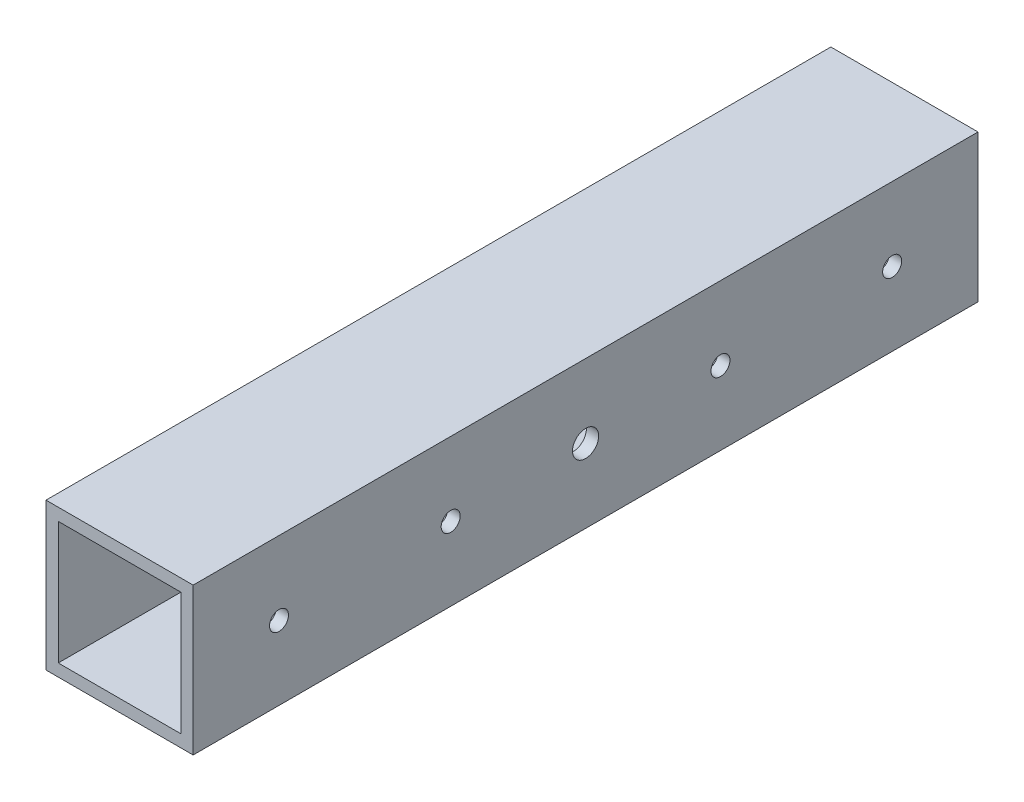
ISO-10303-21;
HEADER;
FILE_DESCRIPTION(('STEP AP214'),'2;1');
FILE_NAME('part.step','',(''),(''),'','','');
FILE_SCHEMA(('AUTOMOTIVE_DESIGN { 1 0 10303 214 1 1 1 1 }'));
ENDSEC;
DATA;
#1=APPLICATION_CONTEXT('core data for automotive mechanical design processes');
#2=APPLICATION_PROTOCOL_DEFINITION('international standard','automotive_design',2000,#1);
#3=PRODUCT_CONTEXT('',#1,'mechanical');
#4=PRODUCT('Part','Part','',(#3));
#5=PRODUCT_RELATED_PRODUCT_CATEGORY('part','',(#4));
#6=PRODUCT_DEFINITION_FORMATION('','',#4);
#7=PRODUCT_DEFINITION_CONTEXT('part definition',#1,'design');
#8=PRODUCT_DEFINITION('design','',#6,#7);
#9=PRODUCT_DEFINITION_SHAPE('','',#8);
#10=(LENGTH_UNIT() NAMED_UNIT(*) SI_UNIT(.MILLI.,.METRE.));
#11=(NAMED_UNIT(*) PLANE_ANGLE_UNIT() SI_UNIT($,.RADIAN.));
#12=(NAMED_UNIT(*) SI_UNIT($,.STERADIAN.) SOLID_ANGLE_UNIT());
#13=UNCERTAINTY_MEASURE_WITH_UNIT(LENGTH_MEASURE(1.E-05),#10,'distance_accuracy_value','');
#14=(GEOMETRIC_REPRESENTATION_CONTEXT(3) GLOBAL_UNCERTAINTY_ASSIGNED_CONTEXT((#13)) GLOBAL_UNIT_ASSIGNED_CONTEXT((#10,
#11,#12)) REPRESENTATION_CONTEXT('',''));
#15=CARTESIAN_POINT('',(0.,0.,0.));
#16=DIRECTION('',(0.,0.,1.));
#17=DIRECTION('',(1.,0.,0.));
#18=AXIS2_PLACEMENT_3D('',#15,#16,#17);
#19=CARTESIAN_POINT('',(1.04083408558608E-13,0.,203.2));
#20=DIRECTION('',(0.,0.,-1.));
#21=DIRECTION('',(-1.,0.,0.));
#22=AXIS2_PLACEMENT_3D('',#19,#20,#21);
#23=PLANE('',#22);
#24=DIRECTION('',(0.,1.,0.));
#25=VECTOR('',#24,1.);
#26=CARTESIAN_POINT('',(19.0500000000001,-19.05,203.2));
#27=LINE('',#26,#25);
#28=CARTESIAN_POINT('',(19.0500000000001,-19.05,203.2));
#29=VERTEX_POINT('',#28);
#30=CARTESIAN_POINT('',(19.0500000000001,19.05,203.2));
#31=VERTEX_POINT('',#30);
#32=EDGE_CURVE('E155',#29,#31,#27,.T.);
#33=ORIENTED_EDGE('',*,*,#32,.T.);
#34=DIRECTION('',(-1.,0.,0.));
#35=VECTOR('',#34,1.);
#36=CARTESIAN_POINT('',(-19.05,19.05,203.2));
#37=LINE('',#36,#35);
#38=CARTESIAN_POINT('',(-19.05,19.05,203.2));
#39=VERTEX_POINT('',#38);
#40=EDGE_CURVE('E159',#31,#39,#37,.T.);
#41=ORIENTED_EDGE('',*,*,#40,.T.);
#42=DIRECTION('',(0.,-1.,0.));
#43=VECTOR('',#42,1.);
#44=CARTESIAN_POINT('',(-19.05,-19.05,203.2));
#45=LINE('',#44,#43);
#46=CARTESIAN_POINT('',(-19.05,-19.05,203.2));
#47=VERTEX_POINT('',#46);
#48=EDGE_CURVE('E163',#39,#47,#45,.T.);
#49=ORIENTED_EDGE('',*,*,#48,.T.);
#50=DIRECTION('',(1.,0.,0.));
#51=VECTOR('',#50,1.);
#52=CARTESIAN_POINT('',(-19.05,-19.05,203.2));
#53=LINE('',#52,#51);
#54=EDGE_CURVE('E166',#47,#29,#53,.T.);
#55=ORIENTED_EDGE('',*,*,#54,.T.);
#56=EDGE_LOOP('',(#33,#41,#49,#55));
#57=FACE_BOUND('',#56,.T.);
#58=DIRECTION('',(0.,-1.,0.));
#59=VECTOR('',#58,1.);
#60=CARTESIAN_POINT('',(-15.875,-15.875,203.2));
#61=LINE('',#60,#59);
#62=CARTESIAN_POINT('',(-15.875,15.875,203.2));
#63=VERTEX_POINT('',#62);
#64=CARTESIAN_POINT('',(-15.875,-15.875,203.2));
#65=VERTEX_POINT('',#64);
#66=EDGE_CURVE('E104',#63,#65,#61,.T.);
#67=ORIENTED_EDGE('',*,*,#66,.F.);
#68=DIRECTION('',(-1.,0.,0.));
#69=VECTOR('',#68,1.);
#70=CARTESIAN_POINT('',(-15.875,15.875,203.2));
#71=LINE('',#70,#69);
#72=CARTESIAN_POINT('',(15.8750000000001,15.875,203.2));
#73=VERTEX_POINT('',#72);
#74=EDGE_CURVE('E131',#73,#63,#71,.T.);
#75=ORIENTED_EDGE('',*,*,#74,.F.);
#76=DIRECTION('',(0.,1.,0.));
#77=VECTOR('',#76,1.);
#78=CARTESIAN_POINT('',(15.8750000000001,-15.875,203.2));
#79=LINE('',#78,#77);
#80=CARTESIAN_POINT('',(15.8750000000001,-15.875,203.2));
#81=VERTEX_POINT('',#80);
#82=EDGE_CURVE('E126',#81,#73,#79,.T.);
#83=ORIENTED_EDGE('',*,*,#82,.F.);
#84=DIRECTION('',(1.,0.,0.));
#85=VECTOR('',#84,1.);
#86=CARTESIAN_POINT('',(-15.875,-15.875,203.2));
#87=LINE('',#86,#85);
#88=EDGE_CURVE('E113',#65,#81,#87,.T.);
#89=ORIENTED_EDGE('',*,*,#88,.F.);
#90=EDGE_LOOP('',(#67,#75,#83,#89));
#91=FACE_BOUND('',#90,.T.);
#92=ADVANCED_FACE('F36',(#57,#91),#23,.F.);
#93=CARTESIAN_POINT('',(0.,0.,0.));
#94=DIRECTION('',(0.,0.,-1.));
#95=DIRECTION('',(-1.,0.,0.));
#96=AXIS2_PLACEMENT_3D('',#93,#94,#95);
#97=PLANE('',#96);
#98=DIRECTION('',(0.,1.,0.));
#99=VECTOR('',#98,1.);
#100=CARTESIAN_POINT('',(19.05,-19.05,0.));
#101=LINE('',#100,#99);
#102=CARTESIAN_POINT('',(19.05,-19.05,0.));
#103=VERTEX_POINT('',#102);
#104=CARTESIAN_POINT('',(19.05,19.05,0.));
#105=VERTEX_POINT('',#104);
#106=EDGE_CURVE('E122',#103,#105,#101,.T.);
#107=ORIENTED_EDGE('',*,*,#106,.F.);
#108=DIRECTION('',(1.,0.,0.));
#109=VECTOR('',#108,1.);
#110=CARTESIAN_POINT('',(-19.05,-19.05,0.));
#111=LINE('',#110,#109);
#112=CARTESIAN_POINT('',(-19.05,-19.05,0.));
#113=VERTEX_POINT('',#112);
#114=EDGE_CURVE('E160',#113,#103,#111,.T.);
#115=ORIENTED_EDGE('',*,*,#114,.F.);
#116=DIRECTION('',(0.,-1.,0.));
#117=VECTOR('',#116,1.);
#118=CARTESIAN_POINT('',(-19.05,-19.05,0.));
#119=LINE('',#118,#117);
#120=CARTESIAN_POINT('',(-19.05,19.05,0.));
#121=VERTEX_POINT('',#120);
#122=EDGE_CURVE('E176',#121,#113,#119,.T.);
#123=ORIENTED_EDGE('',*,*,#122,.F.);
#124=DIRECTION('',(-1.,0.,0.));
#125=VECTOR('',#124,1.);
#126=CARTESIAN_POINT('',(-19.05,19.05,0.));
#127=LINE('',#126,#125);
#128=EDGE_CURVE('E173',#105,#121,#127,.T.);
#129=ORIENTED_EDGE('',*,*,#128,.F.);
#130=EDGE_LOOP('',(#107,#115,#123,#129));
#131=FACE_BOUND('',#130,.T.);
#132=DIRECTION('',(-1.,0.,0.));
#133=VECTOR('',#132,1.);
#134=CARTESIAN_POINT('',(-15.875,15.875,0.));
#135=LINE('',#134,#133);
#136=CARTESIAN_POINT('',(15.875,15.875,0.));
#137=VERTEX_POINT('',#136);
#138=CARTESIAN_POINT('',(-15.875,15.875,0.));
#139=VERTEX_POINT('',#138);
#140=EDGE_CURVE('E114',#137,#139,#135,.T.);
#141=ORIENTED_EDGE('',*,*,#140,.T.);
#142=DIRECTION('',(0.,-1.,0.));
#143=VECTOR('',#142,1.);
#144=CARTESIAN_POINT('',(-15.875,-15.875,0.));
#145=LINE('',#144,#143);
#146=CARTESIAN_POINT('',(-15.875,-15.875,0.));
#147=VERTEX_POINT('',#146);
#148=EDGE_CURVE('E62',#139,#147,#145,.T.);
#149=ORIENTED_EDGE('',*,*,#148,.T.);
#150=DIRECTION('',(1.,0.,0.));
#151=VECTOR('',#150,1.);
#152=CARTESIAN_POINT('',(-15.875,-15.875,0.));
#153=LINE('',#152,#151);
#154=CARTESIAN_POINT('',(15.875,-15.875,0.));
#155=VERTEX_POINT('',#154);
#156=EDGE_CURVE('E120',#147,#155,#153,.T.);
#157=ORIENTED_EDGE('',*,*,#156,.T.);
#158=DIRECTION('',(0.,1.,0.));
#159=VECTOR('',#158,1.);
#160=CARTESIAN_POINT('',(15.875,-15.875,0.));
#161=LINE('',#160,#159);
#162=EDGE_CURVE('E142',#155,#137,#161,.T.);
#163=ORIENTED_EDGE('',*,*,#162,.T.);
#164=EDGE_LOOP('',(#141,#149,#157,#163));
#165=FACE_BOUND('',#164,.T.);
#166=ADVANCED_FACE('F257',(#131,#165),#97,.T.);
#167=CARTESIAN_POINT('',(19.0500000000001,-19.05,203.2));
#168=DIRECTION('',(-1.,0.,0.));
#169=DIRECTION('',(0.,0.,1.));
#170=AXIS2_PLACEMENT_3D('',#167,#168,#169);
#171=PLANE('',#170);
#172=CARTESIAN_POINT('',(19.05,0.,101.6));
#173=DIRECTION('',(1.,0.,0.));
#174=DIRECTION('',(0.,0.,-1.));
#175=AXIS2_PLACEMENT_3D('',#172,#173,#174);
#176=CIRCLE('',#175,3.3782);
#177=CARTESIAN_POINT('',(19.05,0.,98.2218));
#178=VERTEX_POINT('',#177);
#179=EDGE_CURVE('E308',#178,#178,#176,.T.);
#180=ORIENTED_EDGE('',*,*,#179,.F.);
#181=EDGE_LOOP('',(#180));
#182=FACE_BOUND('',#181,.T.);
#183=CARTESIAN_POINT('',(19.05,0.,22.225));
#184=DIRECTION('',(-1.,0.,0.));
#185=DIRECTION('',(0.,0.,1.));
#186=AXIS2_PLACEMENT_3D('',#183,#184,#185);
#187=CIRCLE('',#186,2.45744999999999);
#188=CARTESIAN_POINT('',(19.05,0.,24.68245));
#189=VERTEX_POINT('',#188);
#190=EDGE_CURVE('E311',#189,#189,#187,.T.);
#191=ORIENTED_EDGE('',*,*,#190,.T.);
#192=EDGE_LOOP('',(#191));
#193=FACE_BOUND('',#192,.T.);
#194=CARTESIAN_POINT('',(19.0500000000001,0.,66.675));
#195=DIRECTION('',(-1.,0.,0.));
#196=DIRECTION('',(0.,0.,1.));
#197=AXIS2_PLACEMENT_3D('',#194,#195,#196);
#198=CIRCLE('',#197,2.45744999999999);
#199=CARTESIAN_POINT('',(19.0500000000001,0.,69.13245));
#200=VERTEX_POINT('',#199);
#201=EDGE_CURVE('E205',#200,#200,#198,.T.);
#202=ORIENTED_EDGE('',*,*,#201,.T.);
#203=EDGE_LOOP('',(#202));
#204=FACE_BOUND('',#203,.T.);
#205=CARTESIAN_POINT('',(19.05,0.,136.525));
#206=DIRECTION('',(-1.,0.,0.));
#207=DIRECTION('',(0.,0.,1.));
#208=AXIS2_PLACEMENT_3D('',#205,#206,#207);
#209=CIRCLE('',#208,2.45744999999999);
#210=CARTESIAN_POINT('',(19.05,0.,138.98245));
#211=VERTEX_POINT('',#210);
#212=EDGE_CURVE('E200',#211,#211,#209,.T.);
#213=ORIENTED_EDGE('',*,*,#212,.T.);
#214=EDGE_LOOP('',(#213));
#215=FACE_BOUND('',#214,.T.);
#216=CARTESIAN_POINT('',(19.0500000000001,0.,180.975));
#217=DIRECTION('',(-1.,0.,0.));
#218=DIRECTION('',(0.,0.,1.));
#219=AXIS2_PLACEMENT_3D('',#216,#217,#218);
#220=CIRCLE('',#219,2.45744999999999);
#221=CARTESIAN_POINT('',(19.0500000000001,0.,183.43245));
#222=VERTEX_POINT('',#221);
#223=EDGE_CURVE('E195',#222,#222,#220,.T.);
#224=ORIENTED_EDGE('',*,*,#223,.T.);
#225=EDGE_LOOP('',(#224));
#226=FACE_BOUND('',#225,.T.);
#227=ORIENTED_EDGE('',*,*,#106,.T.);
#228=DIRECTION('',(0.,0.,-1.));
#229=VECTOR('',#228,1.);
#230=CARTESIAN_POINT('',(19.0500000000001,19.05,203.2));
#231=LINE('',#230,#229);
#232=EDGE_CURVE('E11',#31,#105,#231,.T.);
#233=ORIENTED_EDGE('',*,*,#232,.F.);
#234=ORIENTED_EDGE('',*,*,#32,.F.);
#235=DIRECTION('',(0.,0.,-1.));
#236=VECTOR('',#235,1.);
#237=CARTESIAN_POINT('',(19.0500000000001,-19.05,203.2));
#238=LINE('',#237,#236);
#239=EDGE_CURVE('E169',#29,#103,#238,.T.);
#240=ORIENTED_EDGE('',*,*,#239,.T.);
#241=EDGE_LOOP('',(#227,#233,#234,#240));
#242=FACE_BOUND('',#241,.T.);
#243=ADVANCED_FACE('F38',(#182,#193,#204,#215,#226,#242),#171,.F.);
#244=CARTESIAN_POINT('',(-19.05,19.05,203.2));
#245=DIRECTION('',(0.,-1.,0.));
#246=DIRECTION('',(0.,0.,-1.));
#247=AXIS2_PLACEMENT_3D('',#244,#245,#246);
#248=PLANE('',#247);
#249=ORIENTED_EDGE('',*,*,#128,.T.);
#250=DIRECTION('',(0.,0.,-1.));
#251=VECTOR('',#250,1.);
#252=CARTESIAN_POINT('',(-19.05,19.05,203.2));
#253=LINE('',#252,#251);
#254=EDGE_CURVE('E46',#39,#121,#253,.T.);
#255=ORIENTED_EDGE('',*,*,#254,.F.);
#256=ORIENTED_EDGE('',*,*,#40,.F.);
#257=ORIENTED_EDGE('',*,*,#232,.T.);
#258=EDGE_LOOP('',(#249,#255,#256,#257));
#259=FACE_BOUND('',#258,.T.);
#260=ADVANCED_FACE('F283',(#259),#248,.F.);
#261=CARTESIAN_POINT('',(-19.05,-19.05,203.2));
#262=DIRECTION('',(1.,0.,0.));
#263=DIRECTION('',(0.,0.,-1.));
#264=AXIS2_PLACEMENT_3D('',#261,#262,#263);
#265=PLANE('',#264);
#266=CARTESIAN_POINT('',(-19.05,0.,101.6));
#267=DIRECTION('',(1.,0.,0.));
#268=DIRECTION('',(0.,0.,-1.));
#269=AXIS2_PLACEMENT_3D('',#266,#267,#268);
#270=CIRCLE('',#269,3.37819999999999);
#271=CARTESIAN_POINT('',(-19.05,0.,98.2218));
#272=VERTEX_POINT('',#271);
#273=EDGE_CURVE('E347',#272,#272,#270,.T.);
#274=ORIENTED_EDGE('',*,*,#273,.T.);
#275=EDGE_LOOP('',(#274));
#276=FACE_BOUND('',#275,.T.);
#277=CARTESIAN_POINT('',(-19.05,0.,22.225));
#278=DIRECTION('',(-1.,0.,0.));
#279=DIRECTION('',(0.,0.,1.));
#280=AXIS2_PLACEMENT_3D('',#277,#278,#279);
#281=CIRCLE('',#280,2.45745);
#282=CARTESIAN_POINT('',(-19.05,0.,24.68245));
#283=VERTEX_POINT('',#282);
#284=EDGE_CURVE('E360',#283,#283,#281,.T.);
#285=ORIENTED_EDGE('',*,*,#284,.F.);
#286=EDGE_LOOP('',(#285));
#287=FACE_BOUND('',#286,.T.);
#288=CARTESIAN_POINT('',(-19.05,0.,66.675));
#289=DIRECTION('',(-1.,0.,0.));
#290=DIRECTION('',(0.,0.,1.));
#291=AXIS2_PLACEMENT_3D('',#288,#289,#290);
#292=CIRCLE('',#291,2.45745);
#293=CARTESIAN_POINT('',(-19.05,0.,69.13245));
#294=VERTEX_POINT('',#293);
#295=EDGE_CURVE('E215',#294,#294,#292,.T.);
#296=ORIENTED_EDGE('',*,*,#295,.F.);
#297=EDGE_LOOP('',(#296));
#298=FACE_BOUND('',#297,.T.);
#299=CARTESIAN_POINT('',(-19.05,0.,136.525));
#300=DIRECTION('',(-1.,0.,0.));
#301=DIRECTION('',(0.,0.,1.));
#302=AXIS2_PLACEMENT_3D('',#299,#300,#301);
#303=CIRCLE('',#302,2.45745);
#304=CARTESIAN_POINT('',(-19.05,0.,138.98245));
#305=VERTEX_POINT('',#304);
#306=EDGE_CURVE('E212',#305,#305,#303,.T.);
#307=ORIENTED_EDGE('',*,*,#306,.F.);
#308=EDGE_LOOP('',(#307));
#309=FACE_BOUND('',#308,.T.);
#310=CARTESIAN_POINT('',(-19.05,0.,180.975));
#311=DIRECTION('',(-1.,0.,0.));
#312=DIRECTION('',(0.,0.,1.));
#313=AXIS2_PLACEMENT_3D('',#310,#311,#312);
#314=CIRCLE('',#313,2.45745);
#315=CARTESIAN_POINT('',(-19.05,0.,183.43245));
#316=VERTEX_POINT('',#315);
#317=EDGE_CURVE('E235',#316,#316,#314,.T.);
#318=ORIENTED_EDGE('',*,*,#317,.F.);
#319=EDGE_LOOP('',(#318));
#320=FACE_BOUND('',#319,.T.);
#321=ORIENTED_EDGE('',*,*,#122,.T.);
#322=DIRECTION('',(0.,0.,-1.));
#323=VECTOR('',#322,1.);
#324=CARTESIAN_POINT('',(-19.05,-19.05,203.2));
#325=LINE('',#324,#323);
#326=EDGE_CURVE('E184',#47,#113,#325,.T.);
#327=ORIENTED_EDGE('',*,*,#326,.F.);
#328=ORIENTED_EDGE('',*,*,#48,.F.);
#329=ORIENTED_EDGE('',*,*,#254,.T.);
#330=EDGE_LOOP('',(#321,#327,#328,#329));
#331=FACE_BOUND('',#330,.T.);
#332=ADVANCED_FACE('F280',(#276,#287,#298,#309,#320,#331),#265,.F.);
#333=CARTESIAN_POINT('',(-19.05,-19.05,203.2));
#334=DIRECTION('',(0.,1.,0.));
#335=DIRECTION('',(0.,0.,1.));
#336=AXIS2_PLACEMENT_3D('',#333,#334,#335);
#337=PLANE('',#336);
#338=ORIENTED_EDGE('',*,*,#114,.T.);
#339=ORIENTED_EDGE('',*,*,#239,.F.);
#340=ORIENTED_EDGE('',*,*,#54,.F.);
#341=ORIENTED_EDGE('',*,*,#326,.T.);
#342=EDGE_LOOP('',(#338,#339,#340,#341));
#343=FACE_BOUND('',#342,.T.);
#344=ADVANCED_FACE('F277',(#343),#337,.F.);
#345=CARTESIAN_POINT('',(-15.875,-15.875,203.2));
#346=DIRECTION('',(1.,0.,0.));
#347=DIRECTION('',(0.,0.,-1.));
#348=AXIS2_PLACEMENT_3D('',#345,#346,#347);
#349=PLANE('',#348);
#350=CARTESIAN_POINT('',(-15.875,0.,101.6));
#351=DIRECTION('',(1.,0.,0.));
#352=DIRECTION('',(0.,0.,-1.));
#353=AXIS2_PLACEMENT_3D('',#350,#351,#352);
#354=CIRCLE('',#353,3.37819999999999);
#355=CARTESIAN_POINT('',(-15.875,0.,98.2218));
#356=VERTEX_POINT('',#355);
#357=EDGE_CURVE('E356',#356,#356,#354,.T.);
#358=ORIENTED_EDGE('',*,*,#357,.F.);
#359=EDGE_LOOP('',(#358));
#360=FACE_BOUND('',#359,.T.);
#361=CARTESIAN_POINT('',(-15.875,0.,22.225));
#362=DIRECTION('',(1.,0.,0.));
#363=DIRECTION('',(0.,0.,-1.));
#364=AXIS2_PLACEMENT_3D('',#361,#362,#363);
#365=CIRCLE('',#364,2.45744999999999);
#366=CARTESIAN_POINT('',(-15.875,0.,19.76755));
#367=VERTEX_POINT('',#366);
#368=EDGE_CURVE('E222',#367,#367,#365,.T.);
#369=ORIENTED_EDGE('',*,*,#368,.F.);
#370=EDGE_LOOP('',(#369));
#371=FACE_BOUND('',#370,.T.);
#372=CARTESIAN_POINT('',(-15.875,0.,66.675));
#373=DIRECTION('',(1.,0.,0.));
#374=DIRECTION('',(0.,0.,-1.));
#375=AXIS2_PLACEMENT_3D('',#372,#373,#374);
#376=CIRCLE('',#375,2.45744999999999);
#377=CARTESIAN_POINT('',(-15.875,0.,64.21755));
#378=VERTEX_POINT('',#377);
#379=EDGE_CURVE('E204',#378,#378,#376,.T.);
#380=ORIENTED_EDGE('',*,*,#379,.F.);
#381=EDGE_LOOP('',(#380));
#382=FACE_BOUND('',#381,.T.);
#383=CARTESIAN_POINT('',(-15.875,0.,136.525));
#384=DIRECTION('',(1.,0.,0.));
#385=DIRECTION('',(0.,0.,-1.));
#386=AXIS2_PLACEMENT_3D('',#383,#384,#385);
#387=CIRCLE('',#386,2.45744999999999);
#388=CARTESIAN_POINT('',(-15.875,0.,134.06755));
#389=VERTEX_POINT('',#388);
#390=EDGE_CURVE('E199',#389,#389,#387,.T.);
#391=ORIENTED_EDGE('',*,*,#390,.F.);
#392=EDGE_LOOP('',(#391));
#393=FACE_BOUND('',#392,.T.);
#394=CARTESIAN_POINT('',(-15.875,0.,180.975));
#395=DIRECTION('',(1.,0.,0.));
#396=DIRECTION('',(0.,0.,-1.));
#397=AXIS2_PLACEMENT_3D('',#394,#395,#396);
#398=CIRCLE('',#397,2.45744999999999);
#399=CARTESIAN_POINT('',(-15.875,0.,178.51755));
#400=VERTEX_POINT('',#399);
#401=EDGE_CURVE('E191',#400,#400,#398,.T.);
#402=ORIENTED_EDGE('',*,*,#401,.F.);
#403=EDGE_LOOP('',(#402));
#404=FACE_BOUND('',#403,.T.);
#405=ORIENTED_EDGE('',*,*,#148,.F.);
#406=DIRECTION('',(0.,0.,-1.));
#407=VECTOR('',#406,1.);
#408=CARTESIAN_POINT('',(-15.875,15.875,203.2));
#409=LINE('',#408,#407);
#410=EDGE_CURVE('E108',#63,#139,#409,.T.);
#411=ORIENTED_EDGE('',*,*,#410,.F.);
#412=ORIENTED_EDGE('',*,*,#66,.T.);
#413=DIRECTION('',(0.,0.,-1.));
#414=VECTOR('',#413,1.);
#415=CARTESIAN_POINT('',(-15.875,-15.875,203.2));
#416=LINE('',#415,#414);
#417=EDGE_CURVE('E107',#65,#147,#416,.T.);
#418=ORIENTED_EDGE('',*,*,#417,.T.);
#419=EDGE_LOOP('',(#405,#411,#412,#418));
#420=FACE_BOUND('',#419,.T.);
#421=ADVANCED_FACE('F106',(#360,#371,#382,#393,#404,#420),#349,.T.);
#422=CARTESIAN_POINT('',(-15.875,-15.875,203.2));
#423=DIRECTION('',(0.,1.,0.));
#424=DIRECTION('',(0.,0.,1.));
#425=AXIS2_PLACEMENT_3D('',#422,#423,#424);
#426=PLANE('',#425);
#427=ORIENTED_EDGE('',*,*,#156,.F.);
#428=ORIENTED_EDGE('',*,*,#417,.F.);
#429=ORIENTED_EDGE('',*,*,#88,.T.);
#430=DIRECTION('',(0.,0.,-1.));
#431=VECTOR('',#430,1.);
#432=CARTESIAN_POINT('',(15.8750000000001,-15.875,203.2));
#433=LINE('',#432,#431);
#434=EDGE_CURVE('E123',#81,#155,#433,.T.);
#435=ORIENTED_EDGE('',*,*,#434,.T.);
#436=EDGE_LOOP('',(#427,#428,#429,#435));
#437=FACE_BOUND('',#436,.T.);
#438=ADVANCED_FACE('F117',(#437),#426,.T.);
#439=CARTESIAN_POINT('',(15.8750000000001,-15.875,203.2));
#440=DIRECTION('',(-1.,0.,0.));
#441=DIRECTION('',(0.,0.,1.));
#442=AXIS2_PLACEMENT_3D('',#439,#440,#441);
#443=PLANE('',#442);
#444=CARTESIAN_POINT('',(15.875,0.,101.6));
#445=DIRECTION('',(-1.,0.,0.));
#446=DIRECTION('',(0.,0.,1.));
#447=AXIS2_PLACEMENT_3D('',#444,#445,#446);
#448=CIRCLE('',#447,3.37819999999999);
#449=CARTESIAN_POINT('',(15.875,0.,104.9782));
#450=VERTEX_POINT('',#449);
#451=EDGE_CURVE('E345',#450,#450,#448,.T.);
#452=ORIENTED_EDGE('',*,*,#451,.F.);
#453=EDGE_LOOP('',(#452));
#454=FACE_BOUND('',#453,.T.);
#455=CARTESIAN_POINT('',(15.875,0.,22.225));
#456=DIRECTION('',(-1.,0.,0.));
#457=DIRECTION('',(0.,0.,1.));
#458=AXIS2_PLACEMENT_3D('',#455,#456,#457);
#459=CIRCLE('',#458,2.45744999999999);
#460=CARTESIAN_POINT('',(15.875,0.,24.68245));
#461=VERTEX_POINT('',#460);
#462=EDGE_CURVE('E40',#461,#461,#459,.T.);
#463=ORIENTED_EDGE('',*,*,#462,.F.);
#464=EDGE_LOOP('',(#463));
#465=FACE_BOUND('',#464,.T.);
#466=CARTESIAN_POINT('',(15.8750000000001,0.,66.675));
#467=DIRECTION('',(-1.,0.,0.));
#468=DIRECTION('',(0.,0.,1.));
#469=AXIS2_PLACEMENT_3D('',#466,#467,#468);
#470=CIRCLE('',#469,2.45744999999999);
#471=CARTESIAN_POINT('',(15.8750000000001,0.,69.13245));
#472=VERTEX_POINT('',#471);
#473=EDGE_CURVE('E201',#472,#472,#470,.T.);
#474=ORIENTED_EDGE('',*,*,#473,.F.);
#475=EDGE_LOOP('',(#474));
#476=FACE_BOUND('',#475,.T.);
#477=CARTESIAN_POINT('',(15.875,0.,136.525));
#478=DIRECTION('',(-1.,0.,0.));
#479=DIRECTION('',(0.,0.,1.));
#480=AXIS2_PLACEMENT_3D('',#477,#478,#479);
#481=CIRCLE('',#480,2.45744999999999);
#482=CARTESIAN_POINT('',(15.875,0.,138.98245));
#483=VERTEX_POINT('',#482);
#484=EDGE_CURVE('E196',#483,#483,#481,.T.);
#485=ORIENTED_EDGE('',*,*,#484,.F.);
#486=EDGE_LOOP('',(#485));
#487=FACE_BOUND('',#486,.T.);
#488=CARTESIAN_POINT('',(15.8750000000001,0.,180.975));
#489=DIRECTION('',(-1.,0.,0.));
#490=DIRECTION('',(0.,0.,1.));
#491=AXIS2_PLACEMENT_3D('',#488,#489,#490);
#492=CIRCLE('',#491,2.45744999999999);
#493=CARTESIAN_POINT('',(15.8750000000001,0.,183.43245));
#494=VERTEX_POINT('',#493);
#495=EDGE_CURVE('E139',#494,#494,#492,.T.);
#496=ORIENTED_EDGE('',*,*,#495,.F.);
#497=EDGE_LOOP('',(#496));
#498=FACE_BOUND('',#497,.T.);
#499=ORIENTED_EDGE('',*,*,#162,.F.);
#500=ORIENTED_EDGE('',*,*,#434,.F.);
#501=ORIENTED_EDGE('',*,*,#82,.T.);
#502=DIRECTION('',(0.,0.,-1.));
#503=VECTOR('',#502,1.);
#504=CARTESIAN_POINT('',(15.8750000000001,15.875,203.2));
#505=LINE('',#504,#503);
#506=EDGE_CURVE('E54',#73,#137,#505,.T.);
#507=ORIENTED_EDGE('',*,*,#506,.T.);
#508=EDGE_LOOP('',(#499,#500,#501,#507));
#509=FACE_BOUND('',#508,.T.);
#510=ADVANCED_FACE('F249',(#454,#465,#476,#487,#498,#509),#443,.T.);
#511=CARTESIAN_POINT('',(-15.875,15.875,203.2));
#512=DIRECTION('',(0.,-1.,0.));
#513=DIRECTION('',(0.,0.,-1.));
#514=AXIS2_PLACEMENT_3D('',#511,#512,#513);
#515=PLANE('',#514);
#516=ORIENTED_EDGE('',*,*,#140,.F.);
#517=ORIENTED_EDGE('',*,*,#506,.F.);
#518=ORIENTED_EDGE('',*,*,#74,.T.);
#519=ORIENTED_EDGE('',*,*,#410,.T.);
#520=EDGE_LOOP('',(#516,#517,#518,#519));
#521=FACE_BOUND('',#520,.T.);
#522=ADVANCED_FACE('F252',(#521),#515,.T.);
#523=CARTESIAN_POINT('',(-19.05,0.,180.975));
#524=DIRECTION('',(-1.,0.,0.));
#525=DIRECTION('',(0.,0.,1.));
#526=AXIS2_PLACEMENT_3D('',#523,#524,#525);
#527=CYLINDRICAL_SURFACE('',#526,2.45744999999999);
#528=ORIENTED_EDGE('',*,*,#401,.T.);
#529=EDGE_LOOP('',(#528));
#530=FACE_BOUND('',#529,.T.);
#531=ORIENTED_EDGE('',*,*,#317,.T.);
#532=EDGE_LOOP('',(#531));
#533=FACE_BOUND('',#532,.T.);
#534=ADVANCED_FACE('F259',(#530,#533),#527,.F.);
#535=ORIENTED_EDGE('',*,*,#495,.T.);
#536=EDGE_LOOP('',(#535));
#537=FACE_BOUND('',#536,.T.);
#538=ORIENTED_EDGE('',*,*,#223,.F.);
#539=EDGE_LOOP('',(#538));
#540=FACE_BOUND('',#539,.T.);
#541=ADVANCED_FACE('F246',(#537,#540),#527,.F.);
#542=CARTESIAN_POINT('',(-19.05,0.,136.525));
#543=DIRECTION('',(-1.,0.,0.));
#544=DIRECTION('',(0.,0.,1.));
#545=AXIS2_PLACEMENT_3D('',#542,#543,#544);
#546=CYLINDRICAL_SURFACE('',#545,2.45744999999999);
#547=ORIENTED_EDGE('',*,*,#484,.T.);
#548=EDGE_LOOP('',(#547));
#549=FACE_BOUND('',#548,.T.);
#550=ORIENTED_EDGE('',*,*,#212,.F.);
#551=EDGE_LOOP('',(#550));
#552=FACE_BOUND('',#551,.T.);
#553=ADVANCED_FACE('F317',(#549,#552),#546,.F.);
#554=ORIENTED_EDGE('',*,*,#390,.T.);
#555=EDGE_LOOP('',(#554));
#556=FACE_BOUND('',#555,.T.);
#557=ORIENTED_EDGE('',*,*,#306,.T.);
#558=EDGE_LOOP('',(#557));
#559=FACE_BOUND('',#558,.T.);
#560=ADVANCED_FACE('F321',(#556,#559),#546,.F.);
#561=CARTESIAN_POINT('',(-19.05,0.,66.675));
#562=DIRECTION('',(-1.,0.,0.));
#563=DIRECTION('',(0.,0.,1.));
#564=AXIS2_PLACEMENT_3D('',#561,#562,#563);
#565=CYLINDRICAL_SURFACE('',#564,2.45744999999999);
#566=ORIENTED_EDGE('',*,*,#473,.T.);
#567=EDGE_LOOP('',(#566));
#568=FACE_BOUND('',#567,.T.);
#569=ORIENTED_EDGE('',*,*,#201,.F.);
#570=EDGE_LOOP('',(#569));
#571=FACE_BOUND('',#570,.T.);
#572=ADVANCED_FACE('F325',(#568,#571),#565,.F.);
#573=ORIENTED_EDGE('',*,*,#379,.T.);
#574=EDGE_LOOP('',(#573));
#575=FACE_BOUND('',#574,.T.);
#576=ORIENTED_EDGE('',*,*,#295,.T.);
#577=EDGE_LOOP('',(#576));
#578=FACE_BOUND('',#577,.T.);
#579=ADVANCED_FACE('F328',(#575,#578),#565,.F.);
#580=CARTESIAN_POINT('',(-19.05,0.,22.225));
#581=DIRECTION('',(-1.,0.,0.));
#582=DIRECTION('',(0.,0.,1.));
#583=AXIS2_PLACEMENT_3D('',#580,#581,#582);
#584=CYLINDRICAL_SURFACE('',#583,2.45744999999999);
#585=ORIENTED_EDGE('',*,*,#462,.T.);
#586=EDGE_LOOP('',(#585));
#587=FACE_BOUND('',#586,.T.);
#588=ORIENTED_EDGE('',*,*,#190,.F.);
#589=EDGE_LOOP('',(#588));
#590=FACE_BOUND('',#589,.T.);
#591=ADVANCED_FACE('F329',(#587,#590),#584,.F.);
#592=ORIENTED_EDGE('',*,*,#368,.T.);
#593=EDGE_LOOP('',(#592));
#594=FACE_BOUND('',#593,.T.);
#595=ORIENTED_EDGE('',*,*,#284,.T.);
#596=EDGE_LOOP('',(#595));
#597=FACE_BOUND('',#596,.T.);
#598=ADVANCED_FACE('F332',(#594,#597),#584,.F.);
#599=CARTESIAN_POINT('',(19.05,0.,101.6));
#600=DIRECTION('',(1.,0.,0.));
#601=DIRECTION('',(0.,0.,-1.));
#602=AXIS2_PLACEMENT_3D('',#599,#600,#601);
#603=CYLINDRICAL_SURFACE('',#602,3.37819999999999);
#604=ORIENTED_EDGE('',*,*,#357,.T.);
#605=EDGE_LOOP('',(#604));
#606=FACE_BOUND('',#605,.T.);
#607=ORIENTED_EDGE('',*,*,#273,.F.);
#608=EDGE_LOOP('',(#607));
#609=FACE_BOUND('',#608,.T.);
#610=ADVANCED_FACE('F336',(#606,#609),#603,.F.);
#611=ORIENTED_EDGE('',*,*,#451,.T.);
#612=EDGE_LOOP('',(#611));
#613=FACE_BOUND('',#612,.T.);
#614=ORIENTED_EDGE('',*,*,#179,.T.);
#615=EDGE_LOOP('',(#614));
#616=FACE_BOUND('',#615,.T.);
#617=ADVANCED_FACE('F334',(#613,#616),#603,.F.);
#618=CLOSED_SHELL('',(#92,#166,#243,#260,#332,#344,#421,#438,#510,#522,#534,#541,#553,#560,#572,
#579,#591,#598,#610,#617));
#619=MANIFOLD_SOLID_BREP('B2',#618);
#620=ADVANCED_BREP_SHAPE_REPRESENTATION('',(#18,#619),#14);
#621=SHAPE_DEFINITION_REPRESENTATION(#9,#620);
ENDSEC;
END-ISO-10303-21;
